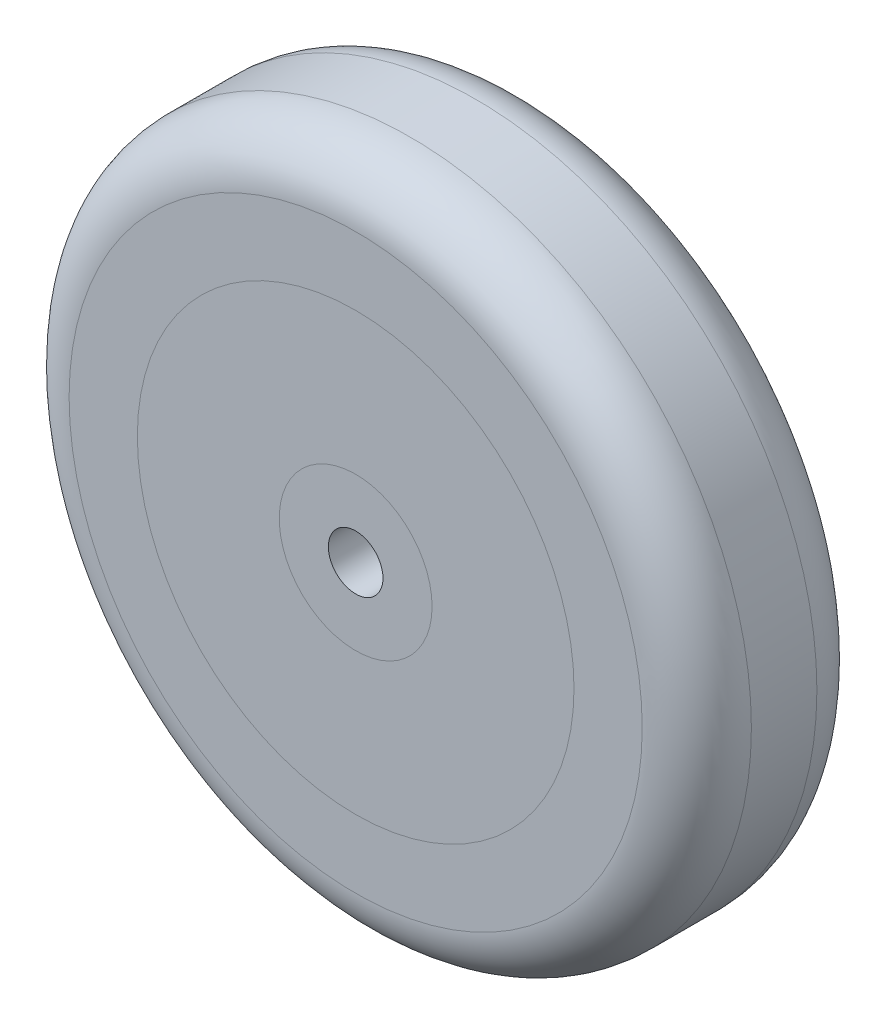
ISO-10303-21;
HEADER;
FILE_DESCRIPTION(('STEP AP214'),'2;1');
FILE_NAME('part.step','',(''),(''),'','','');
FILE_SCHEMA(('AUTOMOTIVE_DESIGN { 1 0 10303 214 1 1 1 1 }'));
ENDSEC;
DATA;
#1=APPLICATION_CONTEXT('core data for automotive mechanical design processes');
#2=APPLICATION_PROTOCOL_DEFINITION('international standard','automotive_design',2000,#1);
#3=PRODUCT_CONTEXT('',#1,'mechanical');
#4=PRODUCT('Part','Part','',(#3));
#5=PRODUCT_RELATED_PRODUCT_CATEGORY('part','',(#4));
#6=PRODUCT_DEFINITION_FORMATION('','',#4);
#7=PRODUCT_DEFINITION_CONTEXT('part definition',#1,'design');
#8=PRODUCT_DEFINITION('design','',#6,#7);
#9=PRODUCT_DEFINITION_SHAPE('','',#8);
#10=(LENGTH_UNIT() NAMED_UNIT(*) SI_UNIT(.MILLI.,.METRE.));
#11=(NAMED_UNIT(*) PLANE_ANGLE_UNIT() SI_UNIT($,.RADIAN.));
#12=(NAMED_UNIT(*) SI_UNIT($,.STERADIAN.) SOLID_ANGLE_UNIT());
#13=UNCERTAINTY_MEASURE_WITH_UNIT(LENGTH_MEASURE(1.E-05),#10,'distance_accuracy_value','');
#14=(GEOMETRIC_REPRESENTATION_CONTEXT(3) GLOBAL_UNCERTAINTY_ASSIGNED_CONTEXT((#13)) GLOBAL_UNIT_ASSIGNED_CONTEXT((#10,
#11,#12)) REPRESENTATION_CONTEXT('',''));
#15=CARTESIAN_POINT('',(0.,0.,0.));
#16=DIRECTION('',(0.,0.,1.));
#17=DIRECTION('',(1.,0.,0.));
#18=AXIS2_PLACEMENT_3D('',#15,#16,#17);
#19=CARTESIAN_POINT('',(0.,0.,-39.5979797464467));
#20=DIRECTION('',(0.,0.,1.));
#21=DIRECTION('',(1.,0.,0.));
#22=AXIS2_PLACEMENT_3D('',#19,#20,#21);
#23=CYLINDRICAL_SURFACE('',#22,14.);
#24=CARTESIAN_POINT('',(0.,0.,0.));
#25=DIRECTION('',(0.,0.,1.));
#26=DIRECTION('',(1.,0.,0.));
#27=AXIS2_PLACEMENT_3D('',#24,#25,#26);
#28=CIRCLE('',#27,14.);
#29=CARTESIAN_POINT('',(14.,0.,0.));
#30=VERTEX_POINT('',#29);
#31=EDGE_CURVE('E11',#30,#30,#28,.F.);
#32=ORIENTED_EDGE('',*,*,#31,.F.);
#33=EDGE_LOOP('',(#32));
#34=FACE_BOUND('',#33,.T.);
#35=CARTESIAN_POINT('',(0.,0.,32.));
#36=DIRECTION('',(0.,0.,1.));
#37=DIRECTION('',(1.,0.,0.));
#38=AXIS2_PLACEMENT_3D('',#35,#36,#37);
#39=CIRCLE('',#38,14.);
#40=CARTESIAN_POINT('',(14.,0.,32.));
#41=VERTEX_POINT('',#40);
#42=EDGE_CURVE('E51',#41,#41,#39,.T.);
#43=ORIENTED_EDGE('',*,*,#42,.F.);
#44=EDGE_LOOP('',(#43));
#45=FACE_BOUND('',#44,.T.);
#46=ADVANCED_FACE('F40',(#34,#45),#23,.T.);
#47=CARTESIAN_POINT('',(0.,0.,32.));
#48=DIRECTION('',(0.,0.,1.));
#49=DIRECTION('',(1.,0.,0.));
#50=AXIS2_PLACEMENT_3D('',#47,#48,#49);
#51=PLANE('',#50);
#52=CARTESIAN_POINT('',(0.,0.,32.));
#53=DIRECTION('',(0.,0.,1.));
#54=DIRECTION('',(1.,0.,0.));
#55=AXIS2_PLACEMENT_3D('',#52,#53,#54);
#56=CIRCLE('',#55,5.);
#57=CARTESIAN_POINT('',(5.,0.,32.));
#58=VERTEX_POINT('',#57);
#59=EDGE_CURVE('E53',#58,#58,#56,.T.);
#60=ORIENTED_EDGE('',*,*,#59,.F.);
#61=EDGE_LOOP('',(#60));
#62=FACE_BOUND('',#61,.T.);
#63=ORIENTED_EDGE('',*,*,#42,.T.);
#64=EDGE_LOOP('',(#63));
#65=FACE_BOUND('',#64,.T.);
#66=ADVANCED_FACE('F58',(#62,#65),#51,.T.);
#67=CARTESIAN_POINT('',(0.,0.,-39.5979797464467));
#68=DIRECTION('',(0.,0.,1.));
#69=DIRECTION('',(1.,0.,0.));
#70=AXIS2_PLACEMENT_3D('',#67,#68,#69);
#71=CYLINDRICAL_SURFACE('',#70,5.);
#72=CARTESIAN_POINT('',(0.,0.,0.));
#73=DIRECTION('',(0.,0.,1.));
#74=DIRECTION('',(1.,0.,0.));
#75=AXIS2_PLACEMENT_3D('',#72,#73,#74);
#76=CIRCLE('',#75,5.);
#77=CARTESIAN_POINT('',(5.,0.,0.));
#78=VERTEX_POINT('',#77);
#79=EDGE_CURVE('E43',#78,#78,#76,.F.);
#80=ORIENTED_EDGE('',*,*,#79,.T.);
#81=EDGE_LOOP('',(#80));
#82=FACE_BOUND('',#81,.T.);
#83=ORIENTED_EDGE('',*,*,#59,.T.);
#84=EDGE_LOOP('',(#83));
#85=FACE_BOUND('',#84,.T.);
#86=ADVANCED_FACE('F65',(#82,#85),#71,.F.);
#87=CARTESIAN_POINT('',(0.,0.,0.));
#88=DIRECTION('',(0.,0.,1.));
#89=DIRECTION('',(1.,0.,0.));
#90=AXIS2_PLACEMENT_3D('',#87,#88,#89);
#91=PLANE('',#90);
#92=ORIENTED_EDGE('',*,*,#31,.T.);
#93=EDGE_LOOP('',(#92));
#94=FACE_BOUND('',#93,.T.);
#95=ORIENTED_EDGE('',*,*,#79,.F.);
#96=EDGE_LOOP('',(#95));
#97=FACE_BOUND('',#96,.T.);
#98=ADVANCED_FACE('F70',(#94,#97),#91,.F.);
#99=CLOSED_SHELL('',(#46,#66,#86,#98));
#100=MANIFOLD_SOLID_BREP('B2',#99);
#101=CARTESIAN_POINT('',(0.,0.,-176.776695296637));
#102=DIRECTION('',(0.,0.,1.));
#103=DIRECTION('',(1.,0.,0.));
#104=AXIS2_PLACEMENT_3D('',#101,#102,#103);
#105=CYLINDRICAL_SURFACE('',#104,62.5);
#106=CARTESIAN_POINT('',(0.,0.,10.));
#107=DIRECTION('',(0.,0.,1.));
#108=DIRECTION('',(1.,0.,0.));
#109=AXIS2_PLACEMENT_3D('',#106,#107,#108);
#110=CIRCLE('',#109,62.5);
#111=CARTESIAN_POINT('',(62.5,0.,10.));
#112=VERTEX_POINT('',#111);
#113=EDGE_CURVE('E116',#112,#112,#110,.T.);
#114=ORIENTED_EDGE('',*,*,#113,.T.);
#115=EDGE_LOOP('',(#114));
#116=FACE_BOUND('',#115,.T.);
#117=CARTESIAN_POINT('',(0.,0.,22.));
#118=DIRECTION('',(0.,0.,1.));
#119=DIRECTION('',(1.,0.,0.));
#120=AXIS2_PLACEMENT_3D('',#117,#118,#119);
#121=CIRCLE('',#120,62.5);
#122=CARTESIAN_POINT('',(62.5,0.,22.));
#123=VERTEX_POINT('',#122);
#124=EDGE_CURVE('E120',#123,#123,#121,.F.);
#125=ORIENTED_EDGE('',*,*,#124,.T.);
#126=EDGE_LOOP('',(#125));
#127=FACE_BOUND('',#126,.T.);
#128=ADVANCED_FACE('F109',(#116,#127),#105,.T.);
#129=CARTESIAN_POINT('',(0.,0.,32.));
#130=DIRECTION('',(0.,0.,1.));
#131=DIRECTION('',(1.,0.,0.));
#132=AXIS2_PLACEMENT_3D('',#129,#130,#131);
#133=PLANE('',#132);
#134=CARTESIAN_POINT('',(0.,0.,32.));
#135=DIRECTION('',(0.,0.,1.));
#136=DIRECTION('',(1.,0.,0.));
#137=AXIS2_PLACEMENT_3D('',#134,#135,#136);
#138=CIRCLE('',#137,52.5);
#139=CARTESIAN_POINT('',(52.5,0.,32.));
#140=VERTEX_POINT('',#139);
#141=EDGE_CURVE('E39',#140,#140,#138,.T.);
#142=ORIENTED_EDGE('',*,*,#141,.T.);
#143=EDGE_LOOP('',(#142));
#144=FACE_BOUND('',#143,.T.);
#145=CARTESIAN_POINT('',(0.,0.,32.));
#146=DIRECTION('',(0.,0.,1.));
#147=DIRECTION('',(1.,0.,0.));
#148=AXIS2_PLACEMENT_3D('',#145,#146,#147);
#149=CIRCLE('',#148,40.);
#150=CARTESIAN_POINT('',(40.,0.,32.));
#151=VERTEX_POINT('',#150);
#152=EDGE_CURVE('E132',#151,#151,#149,.T.);
#153=ORIENTED_EDGE('',*,*,#152,.F.);
#154=EDGE_LOOP('',(#153));
#155=FACE_BOUND('',#154,.T.);
#156=ADVANCED_FACE('F138',(#144,#155),#133,.T.);
#157=CARTESIAN_POINT('',(0.,0.,-176.776695296637));
#158=DIRECTION('',(0.,0.,1.));
#159=DIRECTION('',(1.,0.,0.));
#160=AXIS2_PLACEMENT_3D('',#157,#158,#159);
#161=CYLINDRICAL_SURFACE('',#160,40.);
#162=CARTESIAN_POINT('',(0.,0.,0.));
#163=DIRECTION('',(0.,0.,1.));
#164=DIRECTION('',(1.,0.,0.));
#165=AXIS2_PLACEMENT_3D('',#162,#163,#164);
#166=CIRCLE('',#165,40.);
#167=CARTESIAN_POINT('',(40.,0.,0.));
#168=VERTEX_POINT('',#167);
#169=EDGE_CURVE('E129',#168,#168,#166,.F.);
#170=ORIENTED_EDGE('',*,*,#169,.T.);
#171=EDGE_LOOP('',(#170));
#172=FACE_BOUND('',#171,.T.);
#173=ORIENTED_EDGE('',*,*,#152,.T.);
#174=EDGE_LOOP('',(#173));
#175=FACE_BOUND('',#174,.T.);
#176=ADVANCED_FACE('F136',(#172,#175),#161,.F.);
#177=CARTESIAN_POINT('',(0.,0.,0.));
#178=DIRECTION('',(0.,0.,1.));
#179=DIRECTION('',(1.,0.,0.));
#180=AXIS2_PLACEMENT_3D('',#177,#178,#179);
#181=PLANE('',#180);
#182=CARTESIAN_POINT('',(0.,0.,0.));
#183=DIRECTION('',(0.,0.,1.));
#184=DIRECTION('',(1.,0.,0.));
#185=AXIS2_PLACEMENT_3D('',#182,#183,#184);
#186=CIRCLE('',#185,52.5);
#187=CARTESIAN_POINT('',(52.5,0.,0.));
#188=VERTEX_POINT('',#187);
#189=EDGE_CURVE('E124',#188,#188,#186,.F.);
#190=ORIENTED_EDGE('',*,*,#189,.T.);
#191=EDGE_LOOP('',(#190));
#192=FACE_BOUND('',#191,.T.);
#193=ORIENTED_EDGE('',*,*,#169,.F.);
#194=EDGE_LOOP('',(#193));
#195=FACE_BOUND('',#194,.T.);
#196=ADVANCED_FACE('F145',(#192,#195),#181,.F.);
#197=CARTESIAN_POINT('',(0.,0.,10.));
#198=DIRECTION('',(0.,0.,1.));
#199=DIRECTION('',(1.,0.,0.));
#200=AXIS2_PLACEMENT_3D('',#197,#198,#199);
#201=TOROIDAL_SURFACE('',#200,52.5,10.);
#202=ORIENTED_EDGE('',*,*,#113,.F.);
#203=EDGE_LOOP('',(#202));
#204=FACE_BOUND('',#203,.T.);
#205=ORIENTED_EDGE('',*,*,#189,.F.);
#206=EDGE_LOOP('',(#205));
#207=FACE_BOUND('',#206,.T.);
#208=ADVANCED_FACE('F150',(#204,#207),#201,.T.);
#209=CARTESIAN_POINT('',(0.,0.,22.));
#210=DIRECTION('',(0.,0.,1.));
#211=DIRECTION('',(1.,0.,0.));
#212=AXIS2_PLACEMENT_3D('',#209,#210,#211);
#213=TOROIDAL_SURFACE('',#212,52.5,10.);
#214=ORIENTED_EDGE('',*,*,#124,.F.);
#215=EDGE_LOOP('',(#214));
#216=FACE_BOUND('',#215,.T.);
#217=ORIENTED_EDGE('',*,*,#141,.F.);
#218=EDGE_LOOP('',(#217));
#219=FACE_BOUND('',#218,.T.);
#220=ADVANCED_FACE('F111',(#216,#219),#213,.T.);
#221=CLOSED_SHELL('',(#128,#156,#176,#196,#208,#220));
#222=MANIFOLD_SOLID_BREP('B6',#221);
#223=CARTESIAN_POINT('',(0.,0.,32.));
#224=DIRECTION('',(0.,0.,1.));
#225=DIRECTION('',(1.,0.,0.));
#226=AXIS2_PLACEMENT_3D('',#223,#224,#225);
#227=PLANE('',#226);
#228=CARTESIAN_POINT('',(0.,0.,32.));
#229=DIRECTION('',(0.,0.,1.));
#230=DIRECTION('',(1.,0.,0.));
#231=AXIS2_PLACEMENT_3D('',#228,#229,#230);
#232=CIRCLE('',#231,40.);
#233=CARTESIAN_POINT('',(40.,0.,32.));
#234=VERTEX_POINT('',#233);
#235=EDGE_CURVE('E108',#234,#234,#232,.T.);
#236=ORIENTED_EDGE('',*,*,#235,.T.);
#237=EDGE_LOOP('',(#236));
#238=FACE_BOUND('',#237,.T.);
#239=CARTESIAN_POINT('',(0.,0.,32.));
#240=DIRECTION('',(0.,0.,1.));
#241=DIRECTION('',(1.,0.,0.));
#242=AXIS2_PLACEMENT_3D('',#239,#240,#241);
#243=CIRCLE('',#242,14.);
#244=CARTESIAN_POINT('',(14.,0.,32.));
#245=VERTEX_POINT('',#244);
#246=EDGE_CURVE('E212',#245,#245,#243,.T.);
#247=ORIENTED_EDGE('',*,*,#246,.F.);
#248=EDGE_LOOP('',(#247));
#249=FACE_BOUND('',#248,.T.);
#250=ADVANCED_FACE('F201',(#238,#249),#227,.T.);
#251=CARTESIAN_POINT('',(0.,0.,0.));
#252=DIRECTION('',(0.,0.,1.));
#253=DIRECTION('',(1.,0.,0.));
#254=AXIS2_PLACEMENT_3D('',#251,#252,#253);
#255=PLANE('',#254);
#256=CARTESIAN_POINT('',(0.,0.,0.));
#257=DIRECTION('',(0.,0.,1.));
#258=DIRECTION('',(1.,0.,0.));
#259=AXIS2_PLACEMENT_3D('',#256,#257,#258);
#260=CIRCLE('',#259,40.);
#261=CARTESIAN_POINT('',(40.,0.,0.));
#262=VERTEX_POINT('',#261);
#263=EDGE_CURVE('E205',#262,#262,#260,.T.);
#264=ORIENTED_EDGE('',*,*,#263,.F.);
#265=EDGE_LOOP('',(#264));
#266=FACE_BOUND('',#265,.T.);
#267=CARTESIAN_POINT('',(0.,0.,0.));
#268=DIRECTION('',(0.,0.,1.));
#269=DIRECTION('',(1.,0.,0.));
#270=AXIS2_PLACEMENT_3D('',#267,#268,#269);
#271=CIRCLE('',#270,14.);
#272=CARTESIAN_POINT('',(14.,0.,0.));
#273=VERTEX_POINT('',#272);
#274=EDGE_CURVE('E214',#273,#273,#271,.T.);
#275=ORIENTED_EDGE('',*,*,#274,.T.);
#276=EDGE_LOOP('',(#275));
#277=FACE_BOUND('',#276,.T.);
#278=ADVANCED_FACE('F224',(#266,#277),#255,.F.);
#279=CARTESIAN_POINT('',(0.,0.,32.));
#280=DIRECTION('',(0.,0.,-1.));
#281=DIRECTION('',(-1.,0.,0.));
#282=AXIS2_PLACEMENT_3D('',#279,#280,#281);
#283=CYLINDRICAL_SURFACE('',#282,40.);
#284=ORIENTED_EDGE('',*,*,#235,.F.);
#285=EDGE_LOOP('',(#284));
#286=FACE_BOUND('',#285,.T.);
#287=ORIENTED_EDGE('',*,*,#263,.T.);
#288=EDGE_LOOP('',(#287));
#289=FACE_BOUND('',#288,.T.);
#290=ADVANCED_FACE('F203',(#286,#289),#283,.T.);
#291=CARTESIAN_POINT('',(0.,0.,32.));
#292=DIRECTION('',(0.,0.,-1.));
#293=DIRECTION('',(-1.,0.,0.));
#294=AXIS2_PLACEMENT_3D('',#291,#292,#293);
#295=CYLINDRICAL_SURFACE('',#294,14.);
#296=ORIENTED_EDGE('',*,*,#246,.T.);
#297=EDGE_LOOP('',(#296));
#298=FACE_BOUND('',#297,.T.);
#299=ORIENTED_EDGE('',*,*,#274,.F.);
#300=EDGE_LOOP('',(#299));
#301=FACE_BOUND('',#300,.T.);
#302=ADVANCED_FACE('F220',(#298,#301),#295,.F.);
#303=CLOSED_SHELL('',(#250,#278,#290,#302));
#304=MANIFOLD_SOLID_BREP('B34',#303);
#305=ADVANCED_BREP_SHAPE_REPRESENTATION('',(#18,#100,#222,#304),#14);
#306=SHAPE_DEFINITION_REPRESENTATION(#9,#305);
ENDSEC;
END-ISO-10303-21;
